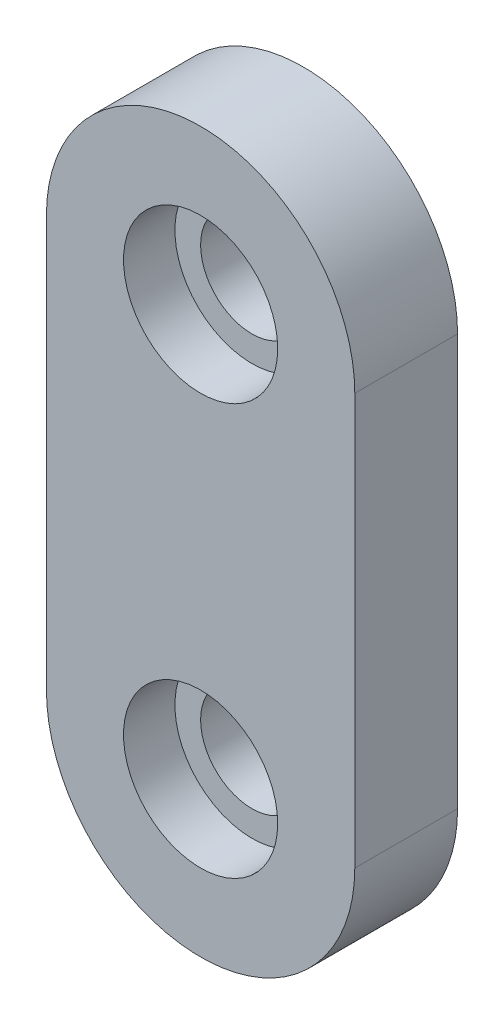
ISO-10303-21;
HEADER;
FILE_DESCRIPTION(('STEP AP214'),'2;1');
FILE_NAME('part.step','',(''),(''),'','','');
FILE_SCHEMA(('AUTOMOTIVE_DESIGN { 1 0 10303 214 1 1 1 1 }'));
ENDSEC;
DATA;
#1=APPLICATION_CONTEXT('core data for automotive mechanical design processes');
#2=APPLICATION_PROTOCOL_DEFINITION('international standard','automotive_design',2000,#1);
#3=PRODUCT_CONTEXT('',#1,'mechanical');
#4=PRODUCT('Part','Part','',(#3));
#5=PRODUCT_RELATED_PRODUCT_CATEGORY('part','',(#4));
#6=PRODUCT_DEFINITION_FORMATION('','',#4);
#7=PRODUCT_DEFINITION_CONTEXT('part definition',#1,'design');
#8=PRODUCT_DEFINITION('design','',#6,#7);
#9=PRODUCT_DEFINITION_SHAPE('','',#8);
#10=(LENGTH_UNIT() NAMED_UNIT(*) SI_UNIT(.MILLI.,.METRE.));
#11=(NAMED_UNIT(*) PLANE_ANGLE_UNIT() SI_UNIT($,.RADIAN.));
#12=(NAMED_UNIT(*) SI_UNIT($,.STERADIAN.) SOLID_ANGLE_UNIT());
#13=UNCERTAINTY_MEASURE_WITH_UNIT(LENGTH_MEASURE(1.E-05),#10,'distance_accuracy_value','');
#14=(GEOMETRIC_REPRESENTATION_CONTEXT(3) GLOBAL_UNCERTAINTY_ASSIGNED_CONTEXT((#13)) GLOBAL_UNIT_ASSIGNED_CONTEXT((#10,
#11,#12)) REPRESENTATION_CONTEXT('',''));
#15=CARTESIAN_POINT('',(0.,0.,0.));
#16=DIRECTION('',(0.,0.,1.));
#17=DIRECTION('',(1.,0.,0.));
#18=AXIS2_PLACEMENT_3D('',#15,#16,#17);
#19=CARTESIAN_POINT('',(0.,-12.7,-131.278091493805));
#20=DIRECTION('',(0.,0.,1.));
#21=DIRECTION('',(1.,0.,0.));
#22=AXIS2_PLACEMENT_3D('',#19,#20,#21);
#23=CYLINDRICAL_SURFACE('',#22,3.175);
#24=CARTESIAN_POINT('',(0.,-12.7,-6.35));
#25=DIRECTION('',(0.,0.,1.));
#26=DIRECTION('',(1.,0.,0.));
#27=AXIS2_PLACEMENT_3D('',#24,#25,#26);
#28=CIRCLE('',#27,3.175);
#29=CARTESIAN_POINT('',(3.175,-12.7,-6.35));
#30=VERTEX_POINT('',#29);
#31=CARTESIAN_POINT('',(-3.175,-12.7,-6.35));
#32=VERTEX_POINT('',#31);
#33=EDGE_CURVE('E156',#30,#32,#28,.T.);
#34=ORIENTED_EDGE('',*,*,#33,.T.);
#35=DIRECTION('',(0.,0.,-1.));
#36=VECTOR('',#35,1.);
#37=CARTESIAN_POINT('',(-3.175,-12.7,-131.278091493805));
#38=LINE('',#37,#36);
#39=CARTESIAN_POINT('',(-3.175,-12.7,-9.525));
#40=VERTEX_POINT('',#39);
#41=EDGE_CURVE('E12',#32,#40,#38,.T.);
#42=ORIENTED_EDGE('',*,*,#41,.T.);
#43=CARTESIAN_POINT('',(0.,-12.7,-9.525));
#44=DIRECTION('',(0.,0.,1.));
#45=DIRECTION('',(1.,0.,0.));
#46=AXIS2_PLACEMENT_3D('',#43,#44,#45);
#47=CIRCLE('',#46,3.175);
#48=EDGE_CURVE('E149',#40,#40,#47,.T.);
#49=ORIENTED_EDGE('',*,*,#48,.F.);
#50=ORIENTED_EDGE('',*,*,#41,.F.);
#51=CARTESIAN_POINT('',(0.,-12.7,-6.35));
#52=DIRECTION('',(0.,0.,1.));
#53=DIRECTION('',(1.,0.,0.));
#54=AXIS2_PLACEMENT_3D('',#51,#52,#53);
#55=CIRCLE('',#54,3.175);
#56=EDGE_CURVE('E153',#32,#30,#55,.T.);
#57=ORIENTED_EDGE('',*,*,#56,.T.);
#58=EDGE_LOOP('',(#34,#42,#49,#50,#57));
#59=FACE_BOUND('',#58,.T.);
#60=ADVANCED_FACE('F37',(#59),#23,.F.);
#61=CARTESIAN_POINT('',(0.,12.7,-131.278091493805));
#62=DIRECTION('',(0.,0.,1.));
#63=DIRECTION('',(1.,0.,0.));
#64=AXIS2_PLACEMENT_3D('',#61,#62,#63);
#65=CYLINDRICAL_SURFACE('',#64,3.175);
#66=CARTESIAN_POINT('',(0.,12.7,-6.35));
#67=DIRECTION('',(0.,0.,1.));
#68=DIRECTION('',(1.,0.,0.));
#69=AXIS2_PLACEMENT_3D('',#66,#67,#68);
#70=CIRCLE('',#69,3.175);
#71=CARTESIAN_POINT('',(3.175,12.7,-6.35));
#72=VERTEX_POINT('',#71);
#73=CARTESIAN_POINT('',(-3.175,12.7,-6.35));
#74=VERTEX_POINT('',#73);
#75=EDGE_CURVE('E136',#72,#74,#70,.T.);
#76=ORIENTED_EDGE('',*,*,#75,.T.);
#77=DIRECTION('',(0.,0.,-1.));
#78=VECTOR('',#77,1.);
#79=CARTESIAN_POINT('',(-3.175,12.7,-131.278091493805));
#80=LINE('',#79,#78);
#81=CARTESIAN_POINT('',(-3.175,12.7,-9.525));
#82=VERTEX_POINT('',#81);
#83=EDGE_CURVE('E46',#74,#82,#80,.T.);
#84=ORIENTED_EDGE('',*,*,#83,.T.);
#85=CARTESIAN_POINT('',(0.,12.7,-9.525));
#86=DIRECTION('',(0.,0.,1.));
#87=DIRECTION('',(1.,0.,0.));
#88=AXIS2_PLACEMENT_3D('',#85,#86,#87);
#89=CIRCLE('',#88,3.175);
#90=EDGE_CURVE('E145',#82,#82,#89,.T.);
#91=ORIENTED_EDGE('',*,*,#90,.F.);
#92=ORIENTED_EDGE('',*,*,#83,.F.);
#93=CARTESIAN_POINT('',(0.,12.7,-6.35));
#94=DIRECTION('',(0.,0.,1.));
#95=DIRECTION('',(1.,0.,0.));
#96=AXIS2_PLACEMENT_3D('',#93,#94,#95);
#97=CIRCLE('',#96,3.175);
#98=EDGE_CURVE('E133',#74,#72,#97,.T.);
#99=ORIENTED_EDGE('',*,*,#98,.T.);
#100=EDGE_LOOP('',(#76,#84,#91,#92,#99));
#101=FACE_BOUND('',#100,.T.);
#102=ADVANCED_FACE('F39',(#101),#65,.F.);
#103=CARTESIAN_POINT('',(0.,0.,-9.525));
#104=DIRECTION('',(0.,0.,1.));
#105=DIRECTION('',(1.,0.,0.));
#106=AXIS2_PLACEMENT_3D('',#103,#104,#105);
#107=PLANE('',#106);
#108=ORIENTED_EDGE('',*,*,#48,.T.);
#109=EDGE_LOOP('',(#108));
#110=FACE_BOUND('',#109,.T.);
#111=ORIENTED_EDGE('',*,*,#90,.T.);
#112=EDGE_LOOP('',(#111));
#113=FACE_BOUND('',#112,.T.);
#114=DIRECTION('',(0.,1.,0.));
#115=VECTOR('',#114,1.);
#116=CARTESIAN_POINT('',(-9.525,-12.7,-9.525));
#117=LINE('',#116,#115);
#118=CARTESIAN_POINT('',(-9.525,-12.7,-9.525));
#119=VERTEX_POINT('',#118);
#120=CARTESIAN_POINT('',(-9.525,12.7,-9.525));
#121=VERTEX_POINT('',#120);
#122=EDGE_CURVE('E143',#119,#121,#117,.T.);
#123=ORIENTED_EDGE('',*,*,#122,.T.);
#124=CARTESIAN_POINT('',(0.,12.7,-9.525));
#125=DIRECTION('',(0.,0.,-1.));
#126=DIRECTION('',(-1.,0.,0.));
#127=AXIS2_PLACEMENT_3D('',#124,#125,#126);
#128=CIRCLE('',#127,9.525);
#129=CARTESIAN_POINT('',(9.525,12.7,-9.525));
#130=VERTEX_POINT('',#129);
#131=EDGE_CURVE('E160',#121,#130,#128,.T.);
#132=ORIENTED_EDGE('',*,*,#131,.T.);
#133=DIRECTION('',(0.,-1.,0.));
#134=VECTOR('',#133,1.);
#135=CARTESIAN_POINT('',(9.525,12.7,-9.525));
#136=LINE('',#135,#134);
#137=CARTESIAN_POINT('',(9.525,-12.7,-9.525));
#138=VERTEX_POINT('',#137);
#139=EDGE_CURVE('E128',#130,#138,#136,.T.);
#140=ORIENTED_EDGE('',*,*,#139,.T.);
#141=CARTESIAN_POINT('',(0.,-12.7,-9.525));
#142=DIRECTION('',(0.,0.,-1.));
#143=DIRECTION('',(1.,0.,0.));
#144=AXIS2_PLACEMENT_3D('',#141,#142,#143);
#145=CIRCLE('',#144,9.525);
#146=EDGE_CURVE('E116',#138,#119,#145,.T.);
#147=ORIENTED_EDGE('',*,*,#146,.T.);
#148=EDGE_LOOP('',(#123,#132,#140,#147));
#149=FACE_BOUND('',#148,.T.);
#150=ADVANCED_FACE('F204',(#110,#113,#149),#107,.F.);
#151=CARTESIAN_POINT('',(-9.525,-12.7,-3.175));
#152=DIRECTION('',(-1.,0.,0.));
#153=DIRECTION('',(0.,0.,1.));
#154=AXIS2_PLACEMENT_3D('',#151,#152,#153);
#155=PLANE('',#154);
#156=DIRECTION('',(0.,-1.,0.));
#157=VECTOR('',#156,1.);
#158=CARTESIAN_POINT('',(-9.525,-6.35,-3.175));
#159=LINE('',#158,#157);
#160=CARTESIAN_POINT('',(-9.525,12.7,-3.175));
#161=VERTEX_POINT('',#160);
#162=CARTESIAN_POINT('',(-9.525,-12.7,-3.175));
#163=VERTEX_POINT('',#162);
#164=EDGE_CURVE('E131',#161,#163,#159,.T.);
#165=ORIENTED_EDGE('',*,*,#164,.F.);
#166=DIRECTION('',(0.,0.,-1.));
#167=VECTOR('',#166,1.);
#168=CARTESIAN_POINT('',(-9.525,12.7,-3.175));
#169=LINE('',#168,#167);
#170=EDGE_CURVE('E158',#161,#121,#169,.T.);
#171=ORIENTED_EDGE('',*,*,#170,.T.);
#172=ORIENTED_EDGE('',*,*,#122,.F.);
#173=DIRECTION('',(0.,0.,-1.));
#174=VECTOR('',#173,1.);
#175=CARTESIAN_POINT('',(-9.525,-12.7,-3.175));
#176=LINE('',#175,#174);
#177=EDGE_CURVE('E132',#163,#119,#176,.T.);
#178=ORIENTED_EDGE('',*,*,#177,.F.);
#179=EDGE_LOOP('',(#165,#171,#172,#178));
#180=FACE_BOUND('',#179,.T.);
#181=ADVANCED_FACE('F209',(#180),#155,.T.);
#182=CARTESIAN_POINT('',(0.,12.7,-3.175));
#183=DIRECTION('',(0.,0.,-1.));
#184=DIRECTION('',(-1.,0.,0.));
#185=AXIS2_PLACEMENT_3D('',#182,#183,#184);
#186=CYLINDRICAL_SURFACE('',#185,9.525);
#187=CARTESIAN_POINT('',(0.,12.7,-3.175));
#188=DIRECTION('',(0.,0.,1.));
#189=DIRECTION('',(-1.,0.,0.));
#190=AXIS2_PLACEMENT_3D('',#187,#188,#189);
#191=CIRCLE('',#190,9.525);
#192=CARTESIAN_POINT('',(9.525,12.7,-3.175));
#193=VERTEX_POINT('',#192);
#194=EDGE_CURVE('E139',#193,#161,#191,.T.);
#195=ORIENTED_EDGE('',*,*,#194,.F.);
#196=DIRECTION('',(0.,0.,-1.));
#197=VECTOR('',#196,1.);
#198=CARTESIAN_POINT('',(9.525,12.7,-3.175));
#199=LINE('',#198,#197);
#200=EDGE_CURVE('E125',#193,#130,#199,.T.);
#201=ORIENTED_EDGE('',*,*,#200,.T.);
#202=ORIENTED_EDGE('',*,*,#131,.F.);
#203=ORIENTED_EDGE('',*,*,#170,.F.);
#204=EDGE_LOOP('',(#195,#201,#202,#203));
#205=FACE_BOUND('',#204,.T.);
#206=ADVANCED_FACE('F212',(#205),#186,.T.);
#207=CARTESIAN_POINT('',(9.525,12.7,-3.175));
#208=DIRECTION('',(1.,0.,0.));
#209=DIRECTION('',(0.,1.,0.));
#210=AXIS2_PLACEMENT_3D('',#207,#208,#209);
#211=PLANE('',#210);
#212=DIRECTION('',(0.,1.,0.));
#213=VECTOR('',#212,1.);
#214=CARTESIAN_POINT('',(9.525,6.35,-3.175));
#215=LINE('',#214,#213);
#216=CARTESIAN_POINT('',(9.525,-12.7,-3.175));
#217=VERTEX_POINT('',#216);
#218=EDGE_CURVE('E119',#217,#193,#215,.T.);
#219=ORIENTED_EDGE('',*,*,#218,.F.);
#220=DIRECTION('',(0.,0.,-1.));
#221=VECTOR('',#220,1.);
#222=CARTESIAN_POINT('',(9.525,-12.7,-3.175));
#223=LINE('',#222,#221);
#224=EDGE_CURVE('E108',#217,#138,#223,.T.);
#225=ORIENTED_EDGE('',*,*,#224,.T.);
#226=ORIENTED_EDGE('',*,*,#139,.F.);
#227=ORIENTED_EDGE('',*,*,#200,.F.);
#228=EDGE_LOOP('',(#219,#225,#226,#227));
#229=FACE_BOUND('',#228,.T.);
#230=ADVANCED_FACE('F123',(#229),#211,.T.);
#231=CARTESIAN_POINT('',(0.,-12.7,-3.175));
#232=DIRECTION('',(0.,0.,-1.));
#233=DIRECTION('',(1.,0.,0.));
#234=AXIS2_PLACEMENT_3D('',#231,#232,#233);
#235=CYLINDRICAL_SURFACE('',#234,9.525);
#236=CARTESIAN_POINT('',(0.,-12.7,-3.175));
#237=DIRECTION('',(0.,0.,1.));
#238=DIRECTION('',(1.,0.,0.));
#239=AXIS2_PLACEMENT_3D('',#236,#237,#238);
#240=CIRCLE('',#239,9.525);
#241=EDGE_CURVE('E113',#163,#217,#240,.T.);
#242=ORIENTED_EDGE('',*,*,#241,.F.);
#243=ORIENTED_EDGE('',*,*,#177,.T.);
#244=ORIENTED_EDGE('',*,*,#146,.F.);
#245=ORIENTED_EDGE('',*,*,#224,.F.);
#246=EDGE_LOOP('',(#242,#243,#244,#245));
#247=FACE_BOUND('',#246,.T.);
#248=ADVANCED_FACE('F110',(#247),#235,.T.);
#249=CARTESIAN_POINT('',(0.,12.7,-6.35));
#250=DIRECTION('',(0.,0.,1.));
#251=DIRECTION('',(1.,0.,0.));
#252=AXIS2_PLACEMENT_3D('',#249,#250,#251);
#253=PLANE('',#252);
#254=ORIENTED_EDGE('',*,*,#75,.F.);
#255=ORIENTED_EDGE('',*,*,#98,.F.);
#256=EDGE_LOOP('',(#254,#255));
#257=FACE_BOUND('',#256,.T.);
#258=CARTESIAN_POINT('',(0.,12.7,-6.35));
#259=DIRECTION('',(0.,0.,-1.));
#260=DIRECTION('',(-1.,0.,0.));
#261=AXIS2_PLACEMENT_3D('',#258,#259,#260);
#262=CIRCLE('',#261,4.7625);
#263=CARTESIAN_POINT('',(4.7625,12.7,-6.35));
#264=VERTEX_POINT('',#263);
#265=EDGE_CURVE('E148',#264,#264,#262,.T.);
#266=ORIENTED_EDGE('',*,*,#265,.F.);
#267=EDGE_LOOP('',(#266));
#268=FACE_BOUND('',#267,.T.);
#269=ADVANCED_FACE('F193',(#257,#268),#253,.T.);
#270=CARTESIAN_POINT('',(0.,12.7,0.));
#271=DIRECTION('',(0.,0.,-1.));
#272=DIRECTION('',(-1.,0.,0.));
#273=AXIS2_PLACEMENT_3D('',#270,#271,#272);
#274=CYLINDRICAL_SURFACE('',#273,4.7625);
#275=DIRECTION('',(0.,0.,-1.));
#276=VECTOR('',#275,1.);
#277=CARTESIAN_POINT('',(4.7625,12.7,0.));
#278=LINE('',#277,#276);
#279=CARTESIAN_POINT('',(4.7625,12.7,-3.175));
#280=VERTEX_POINT('',#279);
#281=EDGE_CURVE('E155',#280,#264,#278,.T.);
#282=ORIENTED_EDGE('',*,*,#281,.F.);
#283=CARTESIAN_POINT('',(0.,12.7,-3.175));
#284=DIRECTION('',(0.,0.,-1.));
#285=DIRECTION('',(-1.,0.,0.));
#286=AXIS2_PLACEMENT_3D('',#283,#284,#285);
#287=CIRCLE('',#286,4.7625);
#288=EDGE_CURVE('E52',#280,#280,#287,.F.);
#289=ORIENTED_EDGE('',*,*,#288,.T.);
#290=ORIENTED_EDGE('',*,*,#281,.T.);
#291=ORIENTED_EDGE('',*,*,#265,.T.);
#292=EDGE_LOOP('',(#282,#289,#290,#291));
#293=FACE_BOUND('',#292,.T.);
#294=ADVANCED_FACE('F185',(#293),#274,.F.);
#295=CARTESIAN_POINT('',(0.,-12.7,-6.35));
#296=DIRECTION('',(0.,0.,1.));
#297=DIRECTION('',(1.,0.,0.));
#298=AXIS2_PLACEMENT_3D('',#295,#296,#297);
#299=PLANE('',#298);
#300=ORIENTED_EDGE('',*,*,#33,.F.);
#301=ORIENTED_EDGE('',*,*,#56,.F.);
#302=EDGE_LOOP('',(#300,#301));
#303=FACE_BOUND('',#302,.T.);
#304=CARTESIAN_POINT('',(0.,-12.7,-6.35));
#305=DIRECTION('',(0.,0.,-1.));
#306=DIRECTION('',(-1.,0.,0.));
#307=AXIS2_PLACEMENT_3D('',#304,#305,#306);
#308=CIRCLE('',#307,4.7625);
#309=CARTESIAN_POINT('',(4.7625,-12.7,-6.35));
#310=VERTEX_POINT('',#309);
#311=EDGE_CURVE('E170',#310,#310,#308,.T.);
#312=ORIENTED_EDGE('',*,*,#311,.F.);
#313=EDGE_LOOP('',(#312));
#314=FACE_BOUND('',#313,.T.);
#315=ADVANCED_FACE('F183',(#303,#314),#299,.T.);
#316=CARTESIAN_POINT('',(0.,-12.7,0.));
#317=DIRECTION('',(0.,0.,-1.));
#318=DIRECTION('',(-1.,0.,0.));
#319=AXIS2_PLACEMENT_3D('',#316,#317,#318);
#320=CYLINDRICAL_SURFACE('',#319,4.7625);
#321=DIRECTION('',(0.,0.,-1.));
#322=VECTOR('',#321,1.);
#323=CARTESIAN_POINT('',(4.7625,-12.7,0.));
#324=LINE('',#323,#322);
#325=CARTESIAN_POINT('',(4.7625,-12.7,-3.175));
#326=VERTEX_POINT('',#325);
#327=EDGE_CURVE('E41',#326,#310,#324,.T.);
#328=ORIENTED_EDGE('',*,*,#327,.F.);
#329=CARTESIAN_POINT('',(0.,-12.7,-3.175));
#330=DIRECTION('',(0.,0.,-1.));
#331=DIRECTION('',(-1.,0.,0.));
#332=AXIS2_PLACEMENT_3D('',#329,#330,#331);
#333=CIRCLE('',#332,4.7625);
#334=EDGE_CURVE('E57',#326,#326,#333,.F.);
#335=ORIENTED_EDGE('',*,*,#334,.T.);
#336=ORIENTED_EDGE('',*,*,#327,.T.);
#337=ORIENTED_EDGE('',*,*,#311,.T.);
#338=EDGE_LOOP('',(#328,#335,#336,#337));
#339=FACE_BOUND('',#338,.T.);
#340=ADVANCED_FACE('F180',(#339),#320,.F.);
#341=CARTESIAN_POINT('',(0.,0.,-3.175));
#342=DIRECTION('',(0.,0.,-1.));
#343=DIRECTION('',(-1.,0.,0.));
#344=AXIS2_PLACEMENT_3D('',#341,#342,#343);
#345=PLANE('',#344);
#346=ORIENTED_EDGE('',*,*,#194,.T.);
#347=ORIENTED_EDGE('',*,*,#164,.T.);
#348=ORIENTED_EDGE('',*,*,#241,.T.);
#349=ORIENTED_EDGE('',*,*,#218,.T.);
#350=EDGE_LOOP('',(#346,#347,#348,#349));
#351=FACE_BOUND('',#350,.T.);
#352=ORIENTED_EDGE('',*,*,#334,.F.);
#353=EDGE_LOOP('',(#352));
#354=FACE_BOUND('',#353,.T.);
#355=ORIENTED_EDGE('',*,*,#288,.F.);
#356=EDGE_LOOP('',(#355));
#357=FACE_BOUND('',#356,.T.);
#358=ADVANCED_FACE('F130',(#351,#354,#357),#345,.F.);
#359=CLOSED_SHELL('',(#60,#102,#150,#181,#206,#230,#248,#269,#294,#315,#340,#358));
#360=MANIFOLD_SOLID_BREP('B2',#359);
#361=ADVANCED_BREP_SHAPE_REPRESENTATION('',(#18,#360),#14);
#362=SHAPE_DEFINITION_REPRESENTATION(#9,#361);
ENDSEC;
END-ISO-10303-21;
